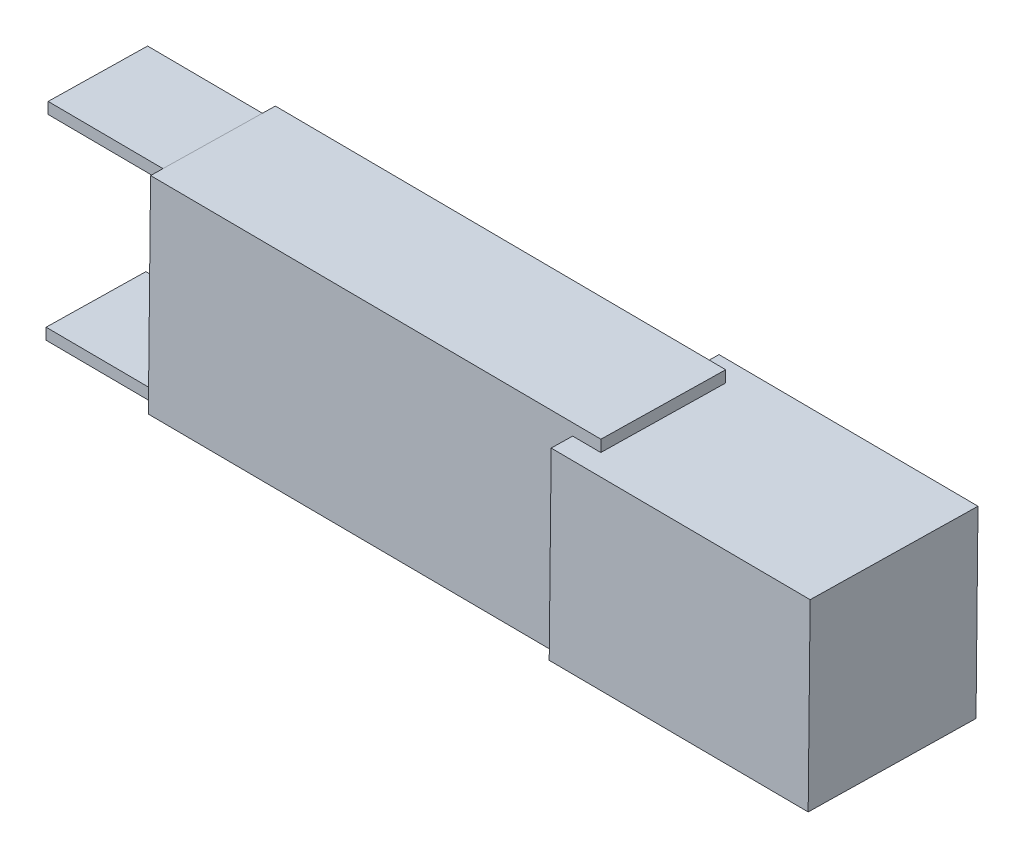
ISO-10303-21;
HEADER;
FILE_DESCRIPTION(('STEP AP214'),'2;1');
FILE_NAME('part.step','',(''),(''),'','','');
FILE_SCHEMA(('AUTOMOTIVE_DESIGN { 1 0 10303 214 1 1 1 1 }'));
ENDSEC;
DATA;
#1=APPLICATION_CONTEXT('core data for automotive mechanical design processes');
#2=APPLICATION_PROTOCOL_DEFINITION('international standard','automotive_design',2000,#1);
#3=PRODUCT_CONTEXT('',#1,'mechanical');
#4=PRODUCT('Part','Part','',(#3));
#5=PRODUCT_RELATED_PRODUCT_CATEGORY('part','',(#4));
#6=PRODUCT_DEFINITION_FORMATION('','',#4);
#7=PRODUCT_DEFINITION_CONTEXT('part definition',#1,'design');
#8=PRODUCT_DEFINITION('design','',#6,#7);
#9=PRODUCT_DEFINITION_SHAPE('','',#8);
#10=(LENGTH_UNIT() NAMED_UNIT(*) SI_UNIT(.MILLI.,.METRE.));
#11=(NAMED_UNIT(*) PLANE_ANGLE_UNIT() SI_UNIT($,.RADIAN.));
#12=(NAMED_UNIT(*) SI_UNIT($,.STERADIAN.) SOLID_ANGLE_UNIT());
#13=UNCERTAINTY_MEASURE_WITH_UNIT(LENGTH_MEASURE(1.E-05),#10,'distance_accuracy_value','');
#14=(GEOMETRIC_REPRESENTATION_CONTEXT(3) GLOBAL_UNCERTAINTY_ASSIGNED_CONTEXT((#13)) GLOBAL_UNIT_ASSIGNED_CONTEXT((#10,
#11,#12)) REPRESENTATION_CONTEXT('',''));
#15=CARTESIAN_POINT('',(0.,0.,0.));
#16=DIRECTION('',(0.,0.,1.));
#17=DIRECTION('',(1.,0.,0.));
#18=AXIS2_PLACEMENT_3D('',#15,#16,#17);
#19=CARTESIAN_POINT('',(32.2323797555974,-270.987568465508,-484.280686747873));
#20=DIRECTION('',(0.999974943834145,7.67787878257996E-05,0.0070785456780591));
#21=DIRECTION('',(0.00707854569892305,0.,-0.999974946781562));
#22=AXIS2_PLACEMENT_3D('',#19,#20,#21);
#23=PLANE('',#22);
#24=DIRECTION('',(0.,0.99994117985244,-0.0108460516000317));
#25=VECTOR('',#24,1.);
#26=CARTESIAN_POINT('',(32.0885356760975,-270.767182877416,-463.962451771121));
#27=LINE('',#26,#25);
#28=CARTESIAN_POINT('',(32.0885356760975,-270.767182877416,-463.962451771121));
#29=VERTEX_POINT('',#28);
#30=CARTESIAN_POINT('',(32.0885356760975,-268.467318163755,-463.987397689801));
#31=VERTEX_POINT('',#30);
#32=EDGE_CURVE('E265',#29,#31,#27,.T.);
#33=ORIENTED_EDGE('',*,*,#32,.T.);
#34=DIRECTION('',(0.00707896206365236,-0.010845779839564,-0.999916125160392));
#35=VECTOR('',#34,1.);
#36=CARTESIAN_POINT('',(32.2323797555974,-268.687703751847,-484.305632666553));
#37=LINE('',#36,#35);
#38=CARTESIAN_POINT('',(32.2323797555974,-268.687703751847,-484.305632666553));
#39=VERTEX_POINT('',#38);
#40=EDGE_CURVE('E245',#31,#39,#37,.T.);
#41=ORIENTED_EDGE('',*,*,#40,.T.);
#42=DIRECTION('',(0.,0.99994117985244,-0.0108460516000317));
#43=VECTOR('',#42,1.);
#44=CARTESIAN_POINT('',(32.2323797555974,-270.987568465508,-484.280686747873));
#45=LINE('',#44,#43);
#46=CARTESIAN_POINT('',(32.2323797555974,-270.987568465508,-484.280686747873));
#47=VERTEX_POINT('',#46);
#48=EDGE_CURVE('E262',#47,#39,#45,.T.);
#49=ORIENTED_EDGE('',*,*,#48,.F.);
#50=DIRECTION('',(0.00707896206365236,-0.010845779839564,-0.999916125160392));
#51=VECTOR('',#50,1.);
#52=CARTESIAN_POINT('',(32.2323797555974,-270.987568465508,-484.280686747873));
#53=LINE('',#52,#51);
#54=EDGE_CURVE('E259',#29,#47,#53,.T.);
#55=ORIENTED_EDGE('',*,*,#54,.F.);
#56=EDGE_LOOP('',(#33,#41,#49,#55));
#57=FACE_BOUND('',#56,.T.);
#58=ADVANCED_FACE('F41',(#57),#23,.F.);
#59=CARTESIAN_POINT('',(32.1009629611345,-228.569359358812,-464.391968776402));
#60=DIRECTION('',(0.999974943834142,7.67787878309515E-05,0.00707854567853408));
#61=DIRECTION('',(0.00707854569939803,0.,-0.999974946781559));
#62=AXIS2_PLACEMENT_3D('',#59,#60,#61);
#63=PLANE('',#62);
#64=DIRECTION('',(0.,-0.99994117985244,0.0108460516000317));
#65=VECTOR('',#64,1.);
#66=CARTESIAN_POINT('',(32.244319629118,-228.788998176678,-484.64135599834));
#67=LINE('',#66,#65);
#68=CARTESIAN_POINT('',(32.244319629118,-228.788998176678,-484.64135599834));
#69=VERTEX_POINT('',#68);
#70=CARTESIAN_POINT('',(32.244319629118,-231.088862890338,-484.61641007966));
#71=VERTEX_POINT('',#70);
#72=EDGE_CURVE('E187',#69,#71,#67,.T.);
#73=ORIENTED_EDGE('',*,*,#72,.T.);
#74=DIRECTION('',(-0.00707896206412736,0.0108457798395628,0.999916125160389));
#75=VECTOR('',#74,1.);
#76=CARTESIAN_POINT('',(32.1009629611345,-230.869224072473,-464.367022857721));
#77=LINE('',#76,#75);
#78=CARTESIAN_POINT('',(32.1009629611345,-230.869224072473,-464.367022857721));
#79=VERTEX_POINT('',#78);
#80=EDGE_CURVE('E190',#71,#79,#77,.T.);
#81=ORIENTED_EDGE('',*,*,#80,.T.);
#82=DIRECTION('',(0.,-0.99994117985244,0.0108460516000317));
#83=VECTOR('',#82,1.);
#84=CARTESIAN_POINT('',(32.1009629611345,-228.569359358812,-464.391968776402));
#85=LINE('',#84,#83);
#86=CARTESIAN_POINT('',(32.1009629611345,-228.569359358812,-464.391968776402));
#87=VERTEX_POINT('',#86);
#88=EDGE_CURVE('E196',#87,#79,#85,.T.);
#89=ORIENTED_EDGE('',*,*,#88,.F.);
#90=DIRECTION('',(-0.00707896206412736,0.0108457798395628,0.999916125160389));
#91=VECTOR('',#90,1.);
#92=CARTESIAN_POINT('',(32.1009629611345,-228.569359358812,-464.391968776402));
#93=LINE('',#92,#91);
#94=EDGE_CURVE('E192',#69,#87,#93,.T.);
#95=ORIENTED_EDGE('',*,*,#94,.F.);
#96=EDGE_LOOP('',(#73,#81,#89,#95));
#97=FACE_BOUND('',#96,.T.);
#98=ADVANCED_FACE('F188',(#97),#63,.F.);
#99=CARTESIAN_POINT('',(2.12066731612647E-12,-265.703465982964,2.88200302220155));
#100=DIRECTION('',(0.,0.99994117985244,-0.0108460516000318));
#101=DIRECTION('',(0.,0.0108460516000318,0.99994117985244));
#102=AXIS2_PLACEMENT_3D('',#99,#100,#101);
#103=PLANE('',#102);
#104=DIRECTION('',(0.999974943834145,7.67787878250535E-05,0.00707854567806212));
#105=VECTOR('',#104,1.);
#106=CARTESIAN_POINT('',(55.9632418837537,-270.985746393025,-484.112702547279));
#107=LINE('',#106,#105);
#108=CARTESIAN_POINT('',(55.9632418837537,-270.985746393025,-484.112702547279));
#109=VERTEX_POINT('',#108);
#110=EDGE_CURVE('E249',#47,#109,#107,.T.);
#111=ORIENTED_EDGE('',*,*,#110,.T.);
#112=DIRECTION('',(-0.00707896206365304,0.010845779839564,0.999916125160392));
#113=VECTOR('',#112,1.);
#114=CARTESIAN_POINT('',(55.9632418837537,-270.985746393025,-484.112702547279));
#115=LINE('',#114,#113);
#116=CARTESIAN_POINT('',(55.8193978042538,-270.765360804933,-463.794467570527));
#117=VERTEX_POINT('',#116);
#118=EDGE_CURVE('E253',#109,#117,#115,.T.);
#119=ORIENTED_EDGE('',*,*,#118,.T.);
#120=DIRECTION('',(-0.999974943834145,-7.67787878250536E-05,-0.00707854567806212));
#121=VECTOR('',#120,1.);
#122=CARTESIAN_POINT('',(55.8193978042538,-270.765360804933,-463.794467570527));
#123=LINE('',#122,#121);
#124=EDGE_CURVE('E256',#117,#29,#123,.T.);
#125=ORIENTED_EDGE('',*,*,#124,.T.);
#126=ORIENTED_EDGE('',*,*,#54,.T.);
#127=EDGE_LOOP('',(#111,#119,#125,#126));
#128=FACE_BOUND('',#127,.T.);
#129=ADVANCED_FACE('F430',(#128),#103,.F.);
#130=CARTESIAN_POINT('',(55.8193978042538,-270.765360804933,-463.794467570527));
#131=DIRECTION('',(0.00707896206365537,-0.0108457798395639,-0.999916125160392));
#132=DIRECTION('',(0.,0.99994117985244,-0.0108460516000316));
#133=AXIS2_PLACEMENT_3D('',#130,#131,#132);
#134=PLANE('',#133);
#135=DIRECTION('',(0.,0.99994117985244,-0.0108460516000317));
#136=VECTOR('',#135,1.);
#137=CARTESIAN_POINT('',(55.8193978042538,-270.765360804933,-463.794467570527));
#138=LINE('',#137,#136);
#139=CARTESIAN_POINT('',(55.8193978042538,-270.696914244532,-463.795209989123));
#140=VERTEX_POINT('',#139);
#141=EDGE_CURVE('E269',#117,#140,#138,.T.);
#142=ORIENTED_EDGE('',*,*,#141,.T.);
#143=CARTESIAN_POINT('',(55.8193978042538,-268.465496091273,-463.819413489208));
#144=VERTEX_POINT('',#143);
#145=EDGE_CURVE('E268',#140,#144,#138,.T.);
#146=ORIENTED_EDGE('',*,*,#145,.T.);
#147=DIRECTION('',(-0.999974943834145,-7.67787878250536E-05,-0.00707854567806212));
#148=VECTOR('',#147,1.);
#149=CARTESIAN_POINT('',(55.8193978042538,-268.465496091273,-463.819413489208));
#150=LINE('',#149,#148);
#151=EDGE_CURVE('E241',#144,#31,#150,.T.);
#152=ORIENTED_EDGE('',*,*,#151,.T.);
#153=ORIENTED_EDGE('',*,*,#32,.F.);
#154=ORIENTED_EDGE('',*,*,#124,.F.);
#155=EDGE_LOOP('',(#142,#146,#152,#153,#154));
#156=FACE_BOUND('',#155,.T.);
#157=ADVANCED_FACE('F417',(#156),#134,.F.);
#158=CARTESIAN_POINT('',(2.1005194070176E-12,-263.403601269303,2.85705710352148));
#159=DIRECTION('',(0.,0.99994117985244,-0.0108460516000318));
#160=DIRECTION('',(0.,0.0108460516000318,0.99994117985244));
#161=AXIS2_PLACEMENT_3D('',#158,#159,#160);
#162=PLANE('',#161);
#163=DIRECTION('',(0.999974943834145,7.67787878250535E-05,0.00707854567806212));
#164=VECTOR('',#163,1.);
#165=CARTESIAN_POINT('',(55.9632418837537,-268.685881679365,-484.137648465959));
#166=LINE('',#165,#164);
#167=CARTESIAN_POINT('',(55.9632418837537,-268.685881679365,-484.13764846596));
#168=VERTEX_POINT('',#167);
#169=EDGE_CURVE('E234',#39,#168,#166,.T.);
#170=ORIENTED_EDGE('',*,*,#169,.F.);
#171=ORIENTED_EDGE('',*,*,#40,.F.);
#172=ORIENTED_EDGE('',*,*,#151,.F.);
#173=DIRECTION('',(-0.00707896206365304,0.010845779839564,0.999916125160392));
#174=VECTOR('',#173,1.);
#175=CARTESIAN_POINT('',(55.9632418837537,-268.685881679365,-484.137648465959));
#176=LINE('',#175,#174);
#177=EDGE_CURVE('E238',#168,#144,#176,.T.);
#178=ORIENTED_EDGE('',*,*,#177,.F.);
#179=EDGE_LOOP('',(#170,#171,#172,#178));
#180=FACE_BOUND('',#179,.T.);
#181=ADVANCED_FACE('F424',(#180),#162,.T.);
#182=CARTESIAN_POINT('',(55.9632418837537,-270.985746393025,-484.112702547279));
#183=DIRECTION('',(-0.00707896206365536,0.0108457798395639,0.999916125160392));
#184=DIRECTION('',(0.,-0.99994117985244,0.0108460516000316));
#185=AXIS2_PLACEMENT_3D('',#182,#183,#184);
#186=PLANE('',#185);
#187=ORIENTED_EDGE('',*,*,#48,.T.);
#188=ORIENTED_EDGE('',*,*,#169,.T.);
#189=DIRECTION('',(0.,0.99994117985244,-0.0108460516000317));
#190=VECTOR('',#189,1.);
#191=CARTESIAN_POINT('',(55.9632418837537,-270.985746393025,-484.112702547279));
#192=LINE('',#191,#190);
#193=CARTESIAN_POINT('',(55.9632418837537,-270.917299832625,-484.113444965879));
#194=VERTEX_POINT('',#193);
#195=EDGE_CURVE('E65',#194,#168,#192,.T.);
#196=ORIENTED_EDGE('',*,*,#195,.F.);
#197=EDGE_CURVE('E273',#109,#194,#192,.T.);
#198=ORIENTED_EDGE('',*,*,#197,.F.);
#199=ORIENTED_EDGE('',*,*,#110,.F.);
#200=EDGE_LOOP('',(#187,#188,#196,#198,#199));
#201=FACE_BOUND('',#200,.T.);
#202=ADVANCED_FACE('F440',(#201),#186,.F.);
#203=CARTESIAN_POINT('',(55.9625555579921,-228.787177073644,-484.473461175103));
#204=DIRECTION('',(-0.00707896206412703,0.0108457798395638,0.999916125160389));
#205=DIRECTION('',(0.,-0.99994117985244,0.0108460516000316));
#206=AXIS2_PLACEMENT_3D('',#203,#204,#205);
#207=PLANE('',#206);
#208=DIRECTION('',(0.,-0.99994117985244,0.0108460516000317));
#209=VECTOR('',#208,1.);
#210=CARTESIAN_POINT('',(55.9625555579921,-228.787177073644,-484.473461175103));
#211=LINE('',#210,#209);
#212=CARTESIAN_POINT('',(55.9625555579921,-228.787177073644,-484.473461175103));
#213=VERTEX_POINT('',#212);
#214=CARTESIAN_POINT('',(55.9625555579921,-231.087041787319,-484.448515257772));
#215=VERTEX_POINT('',#214);
#216=EDGE_CURVE('E195',#213,#215,#211,.T.);
#217=ORIENTED_EDGE('',*,*,#216,.T.);
#218=DIRECTION('',(-0.999974943834142,-7.67787878304583E-05,-0.00707854567853375));
#219=VECTOR('',#218,1.);
#220=CARTESIAN_POINT('',(55.9625555579921,-231.087041787305,-484.448515256423));
#221=LINE('',#220,#219);
#222=EDGE_CURVE('E57',#215,#71,#221,.T.);
#223=ORIENTED_EDGE('',*,*,#222,.T.);
#224=ORIENTED_EDGE('',*,*,#72,.F.);
#225=DIRECTION('',(-0.999974943834142,-7.67787878304583E-05,-0.00707854567853375));
#226=VECTOR('',#225,1.);
#227=CARTESIAN_POINT('',(55.9625555579921,-228.787177073644,-484.473461175103));
#228=LINE('',#227,#226);
#229=EDGE_CURVE('E218',#213,#69,#228,.T.);
#230=ORIENTED_EDGE('',*,*,#229,.F.);
#231=EDGE_LOOP('',(#217,#223,#224,#230));
#232=FACE_BOUND('',#231,.T.);
#233=ADVANCED_FACE('F203',(#232),#207,.F.);
#234=CARTESIAN_POINT('',(1.8682009032514E-12,-225.805812906852,2.44924556336033));
#235=DIRECTION('',(0.,0.99994117985244,-0.010846051600032));
#236=DIRECTION('',(0.,0.010846051600032,0.99994117985244));
#237=AXIS2_PLACEMENT_3D('',#234,#235,#236);
#238=PLANE('',#237);
#239=DIRECTION('',(0.00707896206412736,-0.0108457798395641,-0.999916125160389));
#240=VECTOR('',#239,1.);
#241=CARTESIAN_POINT('',(55.8191988900086,-230.867402969439,-464.199128034484));
#242=LINE('',#241,#240);
#243=CARTESIAN_POINT('',(55.8191988900086,-230.867402969439,-464.199128034484));
#244=VERTEX_POINT('',#243);
#245=EDGE_CURVE('E207',#244,#215,#242,.T.);
#246=ORIENTED_EDGE('',*,*,#245,.F.);
#247=DIRECTION('',(0.999974943834142,7.67787878316285E-05,0.00707854567853375));
#248=VECTOR('',#247,1.);
#249=CARTESIAN_POINT('',(55.8191988900086,-230.867402969439,-464.199128034484));
#250=LINE('',#249,#248);
#251=EDGE_CURVE('E200',#79,#244,#250,.T.);
#252=ORIENTED_EDGE('',*,*,#251,.F.);
#253=ORIENTED_EDGE('',*,*,#80,.F.);
#254=ORIENTED_EDGE('',*,*,#222,.F.);
#255=EDGE_LOOP('',(#246,#252,#253,#254));
#256=FACE_BOUND('',#255,.T.);
#257=ADVANCED_FACE('F198',(#256),#238,.F.);
#258=CARTESIAN_POINT('',(55.8191988900086,-228.567538255778,-464.224073953164));
#259=DIRECTION('',(0.00707896206412704,-0.0108457798395638,-0.999916125160389));
#260=DIRECTION('',(0.,0.99994117985244,-0.0108460516000316));
#261=AXIS2_PLACEMENT_3D('',#258,#259,#260);
#262=PLANE('',#261);
#263=ORIENTED_EDGE('',*,*,#88,.T.);
#264=ORIENTED_EDGE('',*,*,#251,.T.);
#265=DIRECTION('',(0.,-0.99994117985244,0.0108460516000317));
#266=VECTOR('',#265,1.);
#267=CARTESIAN_POINT('',(55.8191988900086,-228.567538255778,-464.224073953164));
#268=LINE('',#267,#266);
#269=CARTESIAN_POINT('',(55.8191988900086,-228.567538255778,-464.224073953164));
#270=VERTEX_POINT('',#269);
#271=EDGE_CURVE('E226',#270,#244,#268,.T.);
#272=ORIENTED_EDGE('',*,*,#271,.F.);
#273=DIRECTION('',(0.999974943834142,7.67787878316285E-05,0.00707854567853375));
#274=VECTOR('',#273,1.);
#275=CARTESIAN_POINT('',(55.8191988900086,-228.567538255778,-464.224073953164));
#276=LINE('',#275,#274);
#277=EDGE_CURVE('E223',#87,#270,#276,.T.);
#278=ORIENTED_EDGE('',*,*,#277,.F.);
#279=EDGE_LOOP('',(#263,#264,#272,#278));
#280=FACE_BOUND('',#279,.T.);
#281=ADVANCED_FACE('F469',(#280),#262,.F.);
#282=CARTESIAN_POINT('',(1.84805299414254E-12,-223.505948193191,2.42429964468026));
#283=DIRECTION('',(0.,0.99994117985244,-0.010846051600032));
#284=DIRECTION('',(0.,0.010846051600032,0.99994117985244));
#285=AXIS2_PLACEMENT_3D('',#282,#283,#284);
#286=PLANE('',#285);
#287=DIRECTION('',(0.00707896206412736,-0.0108457798395641,-0.999916125160389));
#288=VECTOR('',#287,1.);
#289=CARTESIAN_POINT('',(55.8191988900086,-228.567538255778,-464.224073953164));
#290=LINE('',#289,#288);
#291=EDGE_CURVE('E214',#270,#213,#290,.T.);
#292=ORIENTED_EDGE('',*,*,#291,.T.);
#293=ORIENTED_EDGE('',*,*,#229,.T.);
#294=ORIENTED_EDGE('',*,*,#94,.T.);
#295=ORIENTED_EDGE('',*,*,#277,.T.);
#296=EDGE_LOOP('',(#292,#293,#294,#295));
#297=FACE_BOUND('',#296,.T.);
#298=ADVANCED_FACE('F462',(#297),#286,.T.);
#299=CARTESIAN_POINT('',(55.9632418837537,-270.985746393025,-484.112702547279));
#300=DIRECTION('',(-0.999974943834145,-7.6778787825807E-05,-0.00707854567805979));
#301=DIRECTION('',(-0.00707854569892374,0.,0.999974946781562));
#302=AXIS2_PLACEMENT_3D('',#299,#300,#301);
#303=PLANE('',#302);
#304=ORIENTED_EDGE('',*,*,#197,.T.);
#305=DIRECTION('',(-0.00707896206365304,0.0108457798395662,0.999916125160392));
#306=VECTOR('',#305,1.);
#307=CARTESIAN_POINT('',(55.9811632086313,-270.944757352852,-486.64486434179));
#308=LINE('',#307,#306);
#309=EDGE_CURVE('E277',#194,#140,#308,.T.);
#310=ORIENTED_EDGE('',*,*,#309,.T.);
#311=ORIENTED_EDGE('',*,*,#141,.F.);
#312=ORIENTED_EDGE('',*,*,#118,.F.);
#313=EDGE_LOOP('',(#304,#310,#311,#312));
#314=FACE_BOUND('',#313,.T.);
#315=ADVANCED_FACE('F433',(#314),#303,.F.);
#316=CARTESIAN_POINT('',(55.9811632086309,-228.809148925812,-487.10189620767));
#317=DIRECTION('',(0.,-0.99994117985244,0.010846051600034));
#318=DIRECTION('',(0.,-0.010846051600034,-0.99994117985244));
#319=AXIS2_PLACEMENT_3D('',#316,#317,#318);
#320=PLANE('',#319);
#321=DIRECTION('',(0.999974943834145,7.67787878258E-05,0.00707854567805915));
#322=VECTOR('',#321,1.);
#323=CARTESIAN_POINT('',(55.8012688813735,-228.533530233371,-461.691498887824));
#324=LINE('',#323,#322);
#325=CARTESIAN_POINT('',(55.8012688813735,-228.533530233371,-461.691498887824));
#326=VERTEX_POINT('',#325);
#327=CARTESIAN_POINT('',(148.798938657949,-228.526389806103,-461.033194139764));
#328=VERTEX_POINT('',#327);
#329=EDGE_CURVE('E378',#326,#328,#324,.T.);
#330=ORIENTED_EDGE('',*,*,#329,.T.);
#331=DIRECTION('',(0.00707896206365234,-0.0108457798395662,-0.999916125160392));
#332=VECTOR('',#331,1.);
#333=CARTESIAN_POINT('',(148.978832985206,-228.802008498544,-486.443591459611));
#334=LINE('',#333,#332);
#335=CARTESIAN_POINT('',(148.978832985206,-228.802008498544,-486.443591459611));
#336=VERTEX_POINT('',#335);
#337=EDGE_CURVE('E357',#328,#336,#334,.T.);
#338=ORIENTED_EDGE('',*,*,#337,.T.);
#339=DIRECTION('',(0.999974943834145,7.67787878258E-05,0.00707854567805915));
#340=VECTOR('',#339,1.);
#341=CARTESIAN_POINT('',(55.9811632086309,-228.809148925812,-487.10189620767));
#342=LINE('',#341,#340);
#343=CARTESIAN_POINT('',(55.9811632086309,-228.809148925812,-487.10189620767));
#344=VERTEX_POINT('',#343);
#345=EDGE_CURVE('E375',#344,#336,#342,.T.);
#346=ORIENTED_EDGE('',*,*,#345,.F.);
#347=DIRECTION('',(0.00707896206365234,-0.0108457798395662,-0.999916125160392));
#348=VECTOR('',#347,1.);
#349=CARTESIAN_POINT('',(55.9811632086309,-228.809148925812,-487.10189620767));
#350=LINE('',#349,#348);
#351=EDGE_CURVE('E372',#326,#344,#350,.T.);
#352=ORIENTED_EDGE('',*,*,#351,.F.);
#353=EDGE_LOOP('',(#330,#338,#346,#352));
#354=FACE_BOUND('',#353,.T.);
#355=ADVANCED_FACE('F461',(#354),#320,.F.);
#356=CARTESIAN_POINT('',(52.5129040190458,0.00403197814171607,0.37172430377217));
#357=DIRECTION('',(-0.999974943834145,-7.67787878259516E-05,-0.00707854567805936));
#358=DIRECTION('',(-0.00707854569892331,0.,0.999974946781562));
#359=AXIS2_PLACEMENT_3D('',#356,#357,#358);
#360=PLANE('',#359);
#361=ORIENTED_EDGE('',*,*,#291,.F.);
#362=ORIENTED_EDGE('',*,*,#271,.T.);
#363=ORIENTED_EDGE('',*,*,#245,.T.);
#364=ORIENTED_EDGE('',*,*,#216,.F.);
#365=EDGE_LOOP('',(#361,#362,#363,#364));
#366=FACE_BOUND('',#365,.T.);
#367=DIRECTION('',(-0.00707896206365261,0.0108457798395662,0.999916125160392));
#368=VECTOR('',#367,1.);
#369=CARTESIAN_POINT('',(55.9811632086313,-270.944757352852,-486.64486434179));
#370=LINE('',#369,#368);
#371=CARTESIAN_POINT('',(55.9811632086313,-270.944757352852,-486.64486434179));
#372=VERTEX_POINT('',#371);
#373=EDGE_CURVE('E366',#372,#194,#370,.T.);
#374=ORIENTED_EDGE('',*,*,#373,.T.);
#375=ORIENTED_EDGE('',*,*,#195,.T.);
#376=ORIENTED_EDGE('',*,*,#177,.T.);
#377=ORIENTED_EDGE('',*,*,#145,.F.);
#378=CARTESIAN_POINT('',(55.8012688813739,-270.669138660412,-461.234467021943));
#379=VERTEX_POINT('',#378);
#380=EDGE_CURVE('E365',#140,#379,#370,.T.);
#381=ORIENTED_EDGE('',*,*,#380,.T.);
#382=DIRECTION('',(0.,0.99994117985244,-0.0108460516000341));
#383=VECTOR('',#382,1.);
#384=CARTESIAN_POINT('',(55.8012688813735,-228.533530233371,-461.691498887824));
#385=LINE('',#384,#383);
#386=EDGE_CURVE('E369',#379,#326,#385,.T.);
#387=ORIENTED_EDGE('',*,*,#386,.T.);
#388=ORIENTED_EDGE('',*,*,#351,.T.);
#389=DIRECTION('',(0.,-0.99994117985244,0.0108460516000341));
#390=VECTOR('',#389,1.);
#391=CARTESIAN_POINT('',(55.9811632086309,-228.809148925812,-487.10189620767));
#392=LINE('',#391,#390);
#393=EDGE_CURVE('E361',#344,#372,#392,.T.);
#394=ORIENTED_EDGE('',*,*,#393,.T.);
#395=EDGE_LOOP('',(#374,#375,#376,#377,#381,#387,#388,#394));
#396=FACE_BOUND('',#395,.T.);
#397=ADVANCED_FACE('F437',(#366,#396),#360,.T.);
#398=CARTESIAN_POINT('',(55.9811632086313,-270.944757352852,-486.64486434179));
#399=DIRECTION('',(0.,0.99994117985244,-0.010846051600034));
#400=DIRECTION('',(0.,0.010846051600034,0.99994117985244));
#401=AXIS2_PLACEMENT_3D('',#398,#399,#400);
#402=PLANE('',#401);
#403=DIRECTION('',(0.999974943834145,7.67787878258E-05,0.00707854567805915));
#404=VECTOR('',#403,1.);
#405=CARTESIAN_POINT('',(55.9811632086313,-270.944757352852,-486.64486434179));
#406=LINE('',#405,#404);
#407=CARTESIAN_POINT('',(148.978832985207,-270.937616925585,-485.986559593731));
#408=VERTEX_POINT('',#407);
#409=EDGE_CURVE('E385',#372,#408,#406,.T.);
#410=ORIENTED_EDGE('',*,*,#409,.T.);
#411=DIRECTION('',(-0.00707896206365261,0.0108457798395662,0.999916125160392));
#412=VECTOR('',#411,1.);
#413=CARTESIAN_POINT('',(148.978832985207,-270.937616925585,-485.986559593731));
#414=LINE('',#413,#412);
#415=CARTESIAN_POINT('',(148.798938657949,-270.661998233144,-460.576162273884));
#416=VERTEX_POINT('',#415);
#417=EDGE_CURVE('E348',#408,#416,#414,.T.);
#418=ORIENTED_EDGE('',*,*,#417,.T.);
#419=DIRECTION('',(0.999974943834145,7.67787878258E-05,0.00707854567805915));
#420=VECTOR('',#419,1.);
#421=CARTESIAN_POINT('',(55.8012688813739,-270.669138660412,-461.234467021943));
#422=LINE('',#421,#420);
#423=EDGE_CURVE('E382',#379,#416,#422,.T.);
#424=ORIENTED_EDGE('',*,*,#423,.F.);
#425=ORIENTED_EDGE('',*,*,#380,.F.);
#426=ORIENTED_EDGE('',*,*,#309,.F.);
#427=ORIENTED_EDGE('',*,*,#373,.F.);
#428=EDGE_LOOP('',(#410,#418,#424,#425,#426,#427));
#429=FACE_BOUND('',#428,.T.);
#430=ADVANCED_FACE('F435',(#429),#402,.F.);
#431=CARTESIAN_POINT('',(145.510573795621,0.0111724054095155,1.03002905183167));
#432=DIRECTION('',(-0.999974943834145,-7.67787878259516E-05,-0.00707854567805936));
#433=DIRECTION('',(-0.00707854569892331,0.,0.999974946781562));
#434=AXIS2_PLACEMENT_3D('',#431,#432,#433);
#435=PLANE('',#434);
#436=DIRECTION('',(0.,0.99994117985244,-0.0108460516000341));
#437=VECTOR('',#436,1.);
#438=CARTESIAN_POINT('',(148.798938657949,-228.526389806103,-461.033194139764));
#439=LINE('',#438,#437);
#440=CARTESIAN_POINT('',(148.798938657949,-230.882788776435,-461.007635011544));
#441=VERTEX_POINT('',#440);
#442=EDGE_CURVE('E352',#441,#328,#439,.T.);
#443=ORIENTED_EDGE('',*,*,#442,.F.);
#444=DIRECTION('',(0.00707896206365261,-0.0108457798395648,-0.999916125160392));
#445=VECTOR('',#444,1.);
#446=CARTESIAN_POINT('',(145.510573795623,-225.844637560444,3.47981691777225));
#447=LINE('',#446,#445);
#448=CARTESIAN_POINT('',(148.978832985206,-231.158407468876,-486.418032331397));
#449=VERTEX_POINT('',#448);
#450=EDGE_CURVE('E389',#441,#449,#447,.T.);
#451=ORIENTED_EDGE('',*,*,#450,.T.);
#452=DIRECTION('',(0.,-0.99994117985244,0.0108460516000341));
#453=VECTOR('',#452,1.);
#454=CARTESIAN_POINT('',(148.978832985206,-228.802008498544,-486.443591459611));
#455=LINE('',#454,#453);
#456=EDGE_CURVE('E344',#336,#449,#455,.T.);
#457=ORIENTED_EDGE('',*,*,#456,.F.);
#458=ORIENTED_EDGE('',*,*,#337,.F.);
#459=EDGE_LOOP('',(#443,#451,#457,#458));
#460=FACE_BOUND('',#459,.T.);
#461=ADVANCED_FACE('F572',(#460),#435,.F.);
#462=CARTESIAN_POINT('',(55.8012688813735,-228.533530233371,-461.691498887824));
#463=DIRECTION('',(0.0070789620636524,-0.0108457798395663,-0.999916125160392));
#464=DIRECTION('',(0.,0.99994117985244,-0.010846051600034));
#465=AXIS2_PLACEMENT_3D('',#462,#463,#464);
#466=PLANE('',#465);
#467=DIRECTION('',(0.999974943834145,7.67787878260348E-05,0.00707854567805914));
#468=VECTOR('',#467,1.);
#469=CARTESIAN_POINT('',(55.8012688813739,-268.387723448169,-461.259212824608));
#470=LINE('',#469,#468);
#471=CARTESIAN_POINT('',(142.995611045313,-268.381028604525,-460.641988225451));
#472=VERTEX_POINT('',#471);
#473=CARTESIAN_POINT('',(148.798938657949,-268.380583020901,-460.600908076496));
#474=VERTEX_POINT('',#473);
#475=EDGE_CURVE('E334',#472,#474,#470,.T.);
#476=ORIENTED_EDGE('',*,*,#475,.F.);
#477=DIRECTION('',(0.,-0.99994117985244,0.0108460516000341));
#478=VECTOR('',#477,1.);
#479=CARTESIAN_POINT('',(142.995611045312,-228.526835389727,-461.074274288666));
#480=LINE('',#479,#478);
#481=CARTESIAN_POINT('',(142.995611045312,-230.883234360059,-461.048715160452));
#482=VERTEX_POINT('',#481);
#483=EDGE_CURVE('E11',#482,#472,#480,.T.);
#484=ORIENTED_EDGE('',*,*,#483,.F.);
#485=DIRECTION('',(0.999974943834145,7.67787878260348E-05,0.00707854567805914));
#486=VECTOR('',#485,1.);
#487=CARTESIAN_POINT('',(55.8012688813735,-230.889929203703,-461.665939759609));
#488=LINE('',#487,#486);
#489=EDGE_CURVE('E326',#482,#441,#488,.T.);
#490=ORIENTED_EDGE('',*,*,#489,.T.);
#491=ORIENTED_EDGE('',*,*,#442,.T.);
#492=ORIENTED_EDGE('',*,*,#329,.F.);
#493=ORIENTED_EDGE('',*,*,#386,.F.);
#494=ORIENTED_EDGE('',*,*,#423,.T.);
#495=EDGE_CURVE('E353',#416,#474,#439,.T.);
#496=ORIENTED_EDGE('',*,*,#495,.T.);
#497=EDGE_LOOP('',(#476,#484,#490,#491,#492,#493,#494,#496));
#498=FACE_BOUND('',#497,.T.);
#499=ADVANCED_FACE('F580',(#498),#466,.F.);
#500=CARTESIAN_POINT('',(55.9811632086309,-228.809148925812,-487.10189620767));
#501=DIRECTION('',(-0.0070789620636524,0.0108457798395663,0.999916125160392));
#502=DIRECTION('',(0.,-0.99994117985244,0.010846051600034));
#503=AXIS2_PLACEMENT_3D('',#500,#501,#502);
#504=PLANE('',#503);
#505=DIRECTION('',(-0.999974943834145,-7.67787878260348E-05,-0.00707854567805914));
#506=VECTOR('',#505,1.);
#507=CARTESIAN_POINT('',(55.9811632086312,-268.66334214061,-486.669610144455));
#508=LINE('',#507,#506);
#509=CARTESIAN_POINT('',(148.978832985207,-268.656201713342,-486.011305396397));
#510=VERTEX_POINT('',#509);
#511=CARTESIAN_POINT('',(143.17550537257,-268.656647296966,-486.052385545297));
#512=VERTEX_POINT('',#511);
#513=EDGE_CURVE('E337',#510,#512,#508,.T.);
#514=ORIENTED_EDGE('',*,*,#513,.F.);
#515=EDGE_CURVE('E343',#510,#408,#455,.T.);
#516=ORIENTED_EDGE('',*,*,#515,.T.);
#517=ORIENTED_EDGE('',*,*,#409,.F.);
#518=ORIENTED_EDGE('',*,*,#393,.F.);
#519=ORIENTED_EDGE('',*,*,#345,.T.);
#520=ORIENTED_EDGE('',*,*,#456,.T.);
#521=DIRECTION('',(-0.999974943834145,-7.67787878260348E-05,-0.00707854567805914));
#522=VECTOR('',#521,1.);
#523=CARTESIAN_POINT('',(55.9811632086309,-231.165547896143,-487.076337079456));
#524=LINE('',#523,#522);
#525=CARTESIAN_POINT('',(143.17550537257,-231.1588530525,-486.459112480299));
#526=VERTEX_POINT('',#525);
#527=EDGE_CURVE('E330',#449,#526,#524,.T.);
#528=ORIENTED_EDGE('',*,*,#527,.T.);
#529=DIRECTION('',(0.,0.99994117985244,-0.0108460516000341));
#530=VECTOR('',#529,1.);
#531=CARTESIAN_POINT('',(143.17550537257,-228.802454082168,-486.484671608513));
#532=LINE('',#531,#530);
#533=EDGE_CURVE('E340',#512,#526,#532,.T.);
#534=ORIENTED_EDGE('',*,*,#533,.F.);
#535=EDGE_LOOP('',(#514,#516,#517,#518,#519,#520,#528,#534));
#536=FACE_BOUND('',#535,.T.);
#537=ADVANCED_FACE('F43',(#536),#504,.F.);
#538=DIRECTION('',(0.00707896206365261,-0.0108457798395648,-0.999916125160392));
#539=VECTOR('',#538,1.);
#540=CARTESIAN_POINT('',(145.510573795624,-263.34243180491,3.88654385277348));
#541=LINE('',#540,#539);
#542=EDGE_CURVE('E50',#474,#510,#541,.T.);
#543=ORIENTED_EDGE('',*,*,#542,.F.);
#544=ORIENTED_EDGE('',*,*,#495,.F.);
#545=ORIENTED_EDGE('',*,*,#417,.F.);
#546=ORIENTED_EDGE('',*,*,#515,.F.);
#547=EDGE_LOOP('',(#543,#544,#545,#546));
#548=FACE_BOUND('',#547,.T.);
#549=ADVANCED_FACE('F407',(#548),#435,.F.);
#550=CARTESIAN_POINT('',(142.964623147109,-230.835757354449,-456.671618798032));
#551=DIRECTION('',(0.999974943834145,7.6778787825972E-05,0.0070785456780584));
#552=DIRECTION('',(0.00707854569892235,0.,-0.999974946781562));
#553=AXIS2_PLACEMENT_3D('',#550,#551,#552);
#554=PLANE('',#553);
#555=DIRECTION('',(-0.00707896206365165,0.0108457798395648,0.999916125160392));
#556=VECTOR('',#555,1.);
#557=CARTESIAN_POINT('',(142.964623147109,-230.835757354449,-456.671618798032));
#558=LINE('',#557,#556);
#559=CARTESIAN_POINT('',(142.964623147109,-230.835757354449,-456.671618798032));
#560=VERTEX_POINT('',#559);
#561=EDGE_CURVE('E308',#482,#560,#558,.T.);
#562=ORIENTED_EDGE('',*,*,#561,.F.);
#563=ORIENTED_EDGE('',*,*,#483,.T.);
#564=DIRECTION('',(-0.00707896206365165,0.0108457798395648,0.999916125160392));
#565=VECTOR('',#564,1.);
#566=CARTESIAN_POINT('',(142.964623147109,-268.333551598916,-456.26489186303));
#567=LINE('',#566,#565);
#568=CARTESIAN_POINT('',(142.964623147109,-268.333551598916,-456.26489186303));
#569=VERTEX_POINT('',#568);
#570=EDGE_CURVE('E293',#472,#569,#567,.T.);
#571=ORIENTED_EDGE('',*,*,#570,.T.);
#572=DIRECTION('',(0.,-0.99994117985244,0.0108460516000328));
#573=VECTOR('',#572,1.);
#574=CARTESIAN_POINT('',(142.964623147109,-230.835757354449,-456.671618798032));
#575=LINE('',#574,#573);
#576=EDGE_CURVE('E313',#560,#569,#575,.T.);
#577=ORIENTED_EDGE('',*,*,#576,.F.);
#578=EDGE_LOOP('',(#562,#563,#571,#577));
#579=FACE_BOUND('',#578,.T.);
#580=ADVANCED_FACE('F553',(#579),#554,.F.);
#581=CARTESIAN_POINT('',(2.03014117853374E-12,-225.855809965854,2.44978786594058));
#582=DIRECTION('',(0.,0.99994117985244,-0.0108460516000327));
#583=DIRECTION('',(0.,0.0108460516000327,0.99994117985244));
#584=AXIS2_PLACEMENT_3D('',#581,#582,#583);
#585=PLANE('',#584);
#586=ORIENTED_EDGE('',*,*,#527,.F.);
#587=ORIENTED_EDGE('',*,*,#450,.F.);
#588=ORIENTED_EDGE('',*,*,#489,.F.);
#589=ORIENTED_EDGE('',*,*,#561,.T.);
#590=DIRECTION('',(0.999974943834145,7.67787878260198E-05,0.00707854567805776));
#591=VECTOR('',#590,1.);
#592=CARTESIAN_POINT('',(142.964623147109,-230.835757354449,-456.671618798032));
#593=LINE('',#592,#591);
#594=CARTESIAN_POINT('',(196.443439237975,-230.831651212891,-456.293057070218));
#595=VERTEX_POINT('',#594);
#596=EDGE_CURVE('E298',#560,#595,#593,.T.);
#597=ORIENTED_EDGE('',*,*,#596,.T.);
#598=DIRECTION('',(0.00707896206365165,-0.0108457798395648,-0.999916125160392));
#599=VECTOR('',#598,1.);
#600=CARTESIAN_POINT('',(196.443439237975,-230.831651212891,-456.293057070218));
#601=LINE('',#600,#599);
#602=CARTESIAN_POINT('',(196.685395791784,-231.202356337421,-490.46985552822));
#603=VERTEX_POINT('',#602);
#604=EDGE_CURVE('E302',#595,#603,#601,.T.);
#605=ORIENTED_EDGE('',*,*,#604,.T.);
#606=DIRECTION('',(-0.999974943834145,-7.67787878260198E-05,-0.00707854567805776));
#607=VECTOR('',#606,1.);
#608=CARTESIAN_POINT('',(143.206579700917,-231.206462478979,-490.848417256033));
#609=LINE('',#608,#607);
#610=CARTESIAN_POINT('',(143.206579700917,-231.206462478979,-490.848417256033));
#611=VERTEX_POINT('',#610);
#612=EDGE_CURVE('E305',#603,#611,#609,.T.);
#613=ORIENTED_EDGE('',*,*,#612,.T.);
#614=EDGE_CURVE('E309',#611,#526,#558,.T.);
#615=ORIENTED_EDGE('',*,*,#614,.T.);
#616=EDGE_LOOP('',(#586,#587,#588,#589,#597,#605,#613,#615));
#617=FACE_BOUND('',#616,.T.);
#618=ADVANCED_FACE('F550',(#617),#585,.T.);
#619=CARTESIAN_POINT('',(143.206579700918,-268.704256723445,-490.441690321032));
#620=VERTEX_POINT('',#619);
#621=EDGE_CURVE('E294',#620,#512,#567,.T.);
#622=ORIENTED_EDGE('',*,*,#621,.T.);
#623=ORIENTED_EDGE('',*,*,#533,.T.);
#624=ORIENTED_EDGE('',*,*,#614,.F.);
#625=DIRECTION('',(0.,-0.99994117985244,0.0108460516000328));
#626=VECTOR('',#625,1.);
#627=CARTESIAN_POINT('',(143.206579700917,-231.206462478979,-490.848417256033));
#628=LINE('',#627,#626);
#629=EDGE_CURVE('E317',#611,#620,#628,.T.);
#630=ORIENTED_EDGE('',*,*,#629,.T.);
#631=EDGE_LOOP('',(#622,#623,#624,#630));
#632=FACE_BOUND('',#631,.T.);
#633=ADVANCED_FACE('F542',(#632),#554,.F.);
#634=CARTESIAN_POINT('',(2.36511132925435E-12,-263.35360421032,2.85651480094181));
#635=DIRECTION('',(0.,0.99994117985244,-0.0108460516000327));
#636=DIRECTION('',(0.,0.0108460516000327,0.99994117985244));
#637=AXIS2_PLACEMENT_3D('',#634,#635,#636);
#638=PLANE('',#637);
#639=ORIENTED_EDGE('',*,*,#542,.T.);
#640=ORIENTED_EDGE('',*,*,#513,.T.);
#641=ORIENTED_EDGE('',*,*,#621,.F.);
#642=DIRECTION('',(-0.999974943834145,-7.67787878260198E-05,-0.00707854567805776));
#643=VECTOR('',#642,1.);
#644=CARTESIAN_POINT('',(143.206579700918,-268.704256723445,-490.441690321032));
#645=LINE('',#644,#643);
#646=CARTESIAN_POINT('',(196.685395791784,-268.700150581887,-490.063128593219));
#647=VERTEX_POINT('',#646);
#648=EDGE_CURVE('E289',#647,#620,#645,.T.);
#649=ORIENTED_EDGE('',*,*,#648,.F.);
#650=DIRECTION('',(0.00707896206365165,-0.0108457798395648,-0.999916125160392));
#651=VECTOR('',#650,1.);
#652=CARTESIAN_POINT('',(196.443439237976,-268.329445457358,-455.886330135217));
#653=LINE('',#652,#651);
#654=CARTESIAN_POINT('',(196.443439237976,-268.329445457358,-455.886330135217));
#655=VERTEX_POINT('',#654);
#656=EDGE_CURVE('E285',#655,#647,#653,.T.);
#657=ORIENTED_EDGE('',*,*,#656,.F.);
#658=DIRECTION('',(0.999974943834145,7.67787878260198E-05,0.00707854567805776));
#659=VECTOR('',#658,1.);
#660=CARTESIAN_POINT('',(142.964623147109,-268.333551598916,-456.26489186303));
#661=LINE('',#660,#659);
#662=EDGE_CURVE('E281',#569,#655,#661,.T.);
#663=ORIENTED_EDGE('',*,*,#662,.F.);
#664=ORIENTED_EDGE('',*,*,#570,.F.);
#665=ORIENTED_EDGE('',*,*,#475,.T.);
#666=EDGE_LOOP('',(#639,#640,#641,#649,#657,#663,#664,#665));
#667=FACE_BOUND('',#666,.T.);
#668=ADVANCED_FACE('F396',(#667),#638,.F.);
#669=CARTESIAN_POINT('',(142.964623147109,-230.835757354449,-456.671618798032));
#670=DIRECTION('',(0.00707896206365101,-0.0108457798395649,-0.999916125160392));
#671=DIRECTION('',(0.,0.99994117985244,-0.0108460516000327));
#672=AXIS2_PLACEMENT_3D('',#669,#670,#671);
#673=PLANE('',#672);
#674=ORIENTED_EDGE('',*,*,#662,.T.);
#675=DIRECTION('',(0.,-0.99994117985244,0.0108460516000328));
#676=VECTOR('',#675,1.);
#677=CARTESIAN_POINT('',(196.443439237975,-230.831651212891,-456.293057070218));
#678=LINE('',#677,#676);
#679=EDGE_CURVE('E323',#595,#655,#678,.T.);
#680=ORIENTED_EDGE('',*,*,#679,.F.);
#681=ORIENTED_EDGE('',*,*,#596,.F.);
#682=ORIENTED_EDGE('',*,*,#576,.T.);
#683=EDGE_LOOP('',(#674,#680,#681,#682));
#684=FACE_BOUND('',#683,.T.);
#685=ADVANCED_FACE('F502',(#684),#673,.F.);
#686=CARTESIAN_POINT('',(196.443439237975,-230.831651212891,-456.293057070218));
#687=DIRECTION('',(-0.999974943834145,-7.6778787825972E-05,-0.0070785456780584));
#688=DIRECTION('',(-0.00707854569892235,0.,0.999974946781562));
#689=AXIS2_PLACEMENT_3D('',#686,#687,#688);
#690=PLANE('',#689);
#691=ORIENTED_EDGE('',*,*,#679,.T.);
#692=ORIENTED_EDGE('',*,*,#656,.T.);
#693=DIRECTION('',(0.,-0.99994117985244,0.0108460516000328));
#694=VECTOR('',#693,1.);
#695=CARTESIAN_POINT('',(196.685395791784,-231.202356337421,-490.46985552822));
#696=LINE('',#695,#694);
#697=EDGE_CURVE('E320',#603,#647,#696,.T.);
#698=ORIENTED_EDGE('',*,*,#697,.F.);
#699=ORIENTED_EDGE('',*,*,#604,.F.);
#700=EDGE_LOOP('',(#691,#692,#698,#699));
#701=FACE_BOUND('',#700,.T.);
#702=ADVANCED_FACE('F508',(#701),#690,.F.);
#703=CARTESIAN_POINT('',(143.206579700917,-231.206462478979,-490.848417256033));
#704=DIRECTION('',(-0.00707896206365101,0.0108457798395649,0.999916125160392));
#705=DIRECTION('',(0.,-0.99994117985244,0.0108460516000327));
#706=AXIS2_PLACEMENT_3D('',#703,#704,#705);
#707=PLANE('',#706);
#708=ORIENTED_EDGE('',*,*,#697,.T.);
#709=ORIENTED_EDGE('',*,*,#648,.T.);
#710=ORIENTED_EDGE('',*,*,#629,.F.);
#711=ORIENTED_EDGE('',*,*,#612,.F.);
#712=EDGE_LOOP('',(#708,#709,#710,#711));
#713=FACE_BOUND('',#712,.T.);
#714=ADVANCED_FACE('F517',(#713),#707,.F.);
#715=CLOSED_SHELL('',(#58,#98,#129,#157,#181,#202,#233,#257,#281,#298,#315,#355,#397,#430,#461,
#499,#537,#549,#580,#618,#633,#668,#685,#702,#714));
#716=MANIFOLD_SOLID_BREP('B2',#715);
#717=ADVANCED_BREP_SHAPE_REPRESENTATION('',(#18,#716),#14);
#718=SHAPE_DEFINITION_REPRESENTATION(#9,#717);
ENDSEC;
END-ISO-10303-21;
